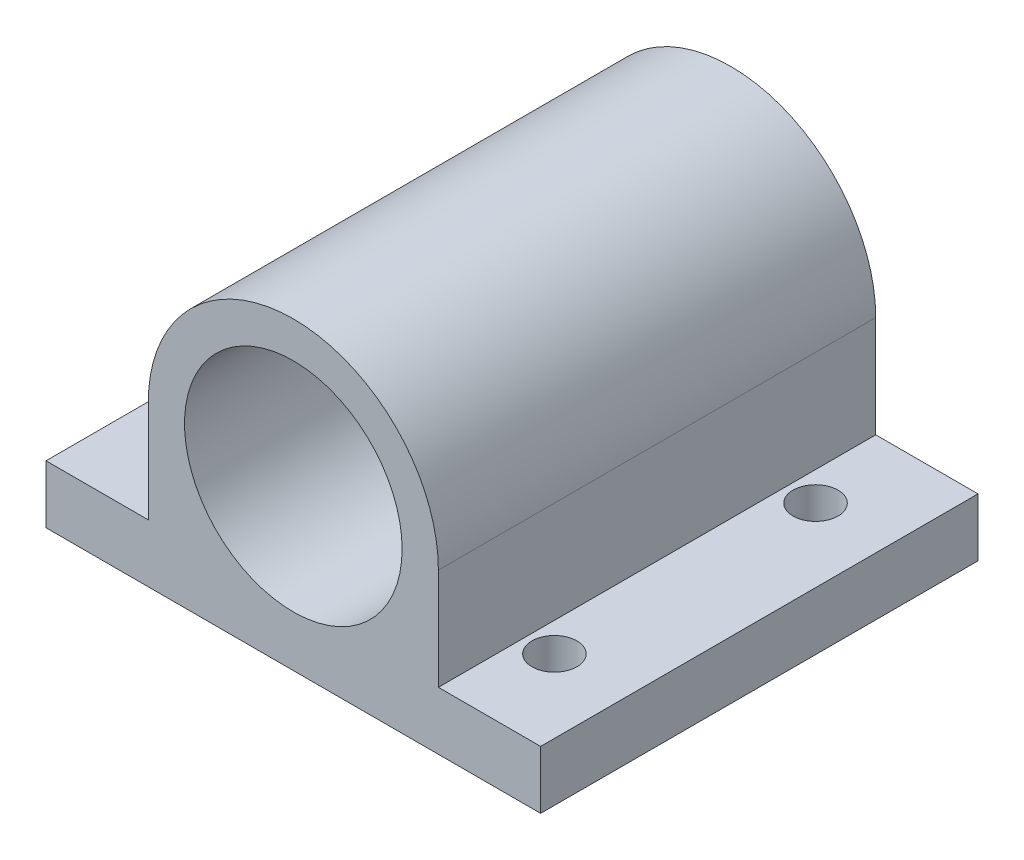
ISO-10303-21;
HEADER;
FILE_DESCRIPTION(('STEP AP214'),'2;1');
FILE_NAME('part.step','',(''),(''),'','','');
FILE_SCHEMA(('AUTOMOTIVE_DESIGN { 1 0 10303 214 1 1 1 1 }'));
ENDSEC;
DATA;
#1=APPLICATION_CONTEXT('core data for automotive mechanical design processes');
#2=APPLICATION_PROTOCOL_DEFINITION('international standard','automotive_design',2000,#1);
#3=PRODUCT_CONTEXT('',#1,'mechanical');
#4=PRODUCT('Part','Part','',(#3));
#5=PRODUCT_RELATED_PRODUCT_CATEGORY('part','',(#4));
#6=PRODUCT_DEFINITION_FORMATION('','',#4);
#7=PRODUCT_DEFINITION_CONTEXT('part definition',#1,'design');
#8=PRODUCT_DEFINITION('design','',#6,#7);
#9=PRODUCT_DEFINITION_SHAPE('','',#8);
#10=(LENGTH_UNIT() NAMED_UNIT(*) SI_UNIT(.MILLI.,.METRE.));
#11=(NAMED_UNIT(*) PLANE_ANGLE_UNIT() SI_UNIT($,.RADIAN.));
#12=(NAMED_UNIT(*) SI_UNIT($,.STERADIAN.) SOLID_ANGLE_UNIT());
#13=UNCERTAINTY_MEASURE_WITH_UNIT(LENGTH_MEASURE(1.E-05),#10,'distance_accuracy_value','');
#14=(GEOMETRIC_REPRESENTATION_CONTEXT(3) GLOBAL_UNCERTAINTY_ASSIGNED_CONTEXT((#13)) GLOBAL_UNIT_ASSIGNED_CONTEXT((#10,
#11,#12)) REPRESENTATION_CONTEXT('',''));
#15=CARTESIAN_POINT('',(0.,0.,0.));
#16=DIRECTION('',(0.,0.,1.));
#17=DIRECTION('',(1.,0.,0.));
#18=AXIS2_PLACEMENT_3D('',#15,#16,#17);
#19=CARTESIAN_POINT('',(0.,0.,-30.15));
#20=DIRECTION('',(1.,0.,0.));
#21=DIRECTION('',(0.,0.,-1.));
#22=AXIS2_PLACEMENT_3D('',#19,#20,#21);
#23=PLANE('',#22);
#24=DIRECTION('',(0.,1.,0.));
#25=VECTOR('',#24,1.);
#26=CARTESIAN_POINT('',(0.,0.,0.));
#27=LINE('',#26,#25);
#28=CARTESIAN_POINT('',(0.,0.,0.));
#29=VERTEX_POINT('',#28);
#30=CARTESIAN_POINT('',(0.,4.,0.));
#31=VERTEX_POINT('',#30);
#32=EDGE_CURVE('E143',#29,#31,#27,.T.);
#33=ORIENTED_EDGE('',*,*,#32,.F.);
#34=DIRECTION('',(0.,0.,1.));
#35=VECTOR('',#34,1.);
#36=CARTESIAN_POINT('',(0.,0.,-30.15));
#37=LINE('',#36,#35);
#38=CARTESIAN_POINT('',(0.,0.,-30.15));
#39=VERTEX_POINT('',#38);
#40=EDGE_CURVE('E11',#39,#29,#37,.T.);
#41=ORIENTED_EDGE('',*,*,#40,.F.);
#42=DIRECTION('',(0.,1.,0.));
#43=VECTOR('',#42,1.);
#44=CARTESIAN_POINT('',(0.,0.,-30.15));
#45=LINE('',#44,#43);
#46=CARTESIAN_POINT('',(0.,4.,-30.15));
#47=VERTEX_POINT('',#46);
#48=EDGE_CURVE('E172',#39,#47,#45,.T.);
#49=ORIENTED_EDGE('',*,*,#48,.T.);
#50=DIRECTION('',(0.,0.,1.));
#51=VECTOR('',#50,1.);
#52=CARTESIAN_POINT('',(0.,4.,-30.15));
#53=LINE('',#52,#51);
#54=EDGE_CURVE('E96',#47,#31,#53,.T.);
#55=ORIENTED_EDGE('',*,*,#54,.T.);
#56=EDGE_LOOP('',(#33,#41,#49,#55));
#57=FACE_BOUND('',#56,.T.);
#58=ADVANCED_FACE('F39',(#57),#23,.T.);
#59=CARTESIAN_POINT('',(0.,0.,-30.15));
#60=DIRECTION('',(0.,-1.,0.));
#61=DIRECTION('',(1.,0.,0.));
#62=AXIS2_PLACEMENT_3D('',#59,#60,#61);
#63=PLANE('',#62);
#64=CARTESIAN_POINT('',(-5.05,0.,-6.));
#65=DIRECTION('',(0.,-1.,0.));
#66=DIRECTION('',(1.,0.,0.));
#67=AXIS2_PLACEMENT_3D('',#64,#65,#66);
#68=CIRCLE('',#67,1.55);
#69=CARTESIAN_POINT('',(-3.5,0.,-6.));
#70=VERTEX_POINT('',#69);
#71=EDGE_CURVE('E284',#70,#70,#68,.T.);
#72=ORIENTED_EDGE('',*,*,#71,.F.);
#73=EDGE_LOOP('',(#72));
#74=FACE_BOUND('',#73,.T.);
#75=CARTESIAN_POINT('',(-5.05,0.,-24.));
#76=DIRECTION('',(0.,-1.,0.));
#77=DIRECTION('',(1.,0.,0.));
#78=AXIS2_PLACEMENT_3D('',#75,#76,#77);
#79=CIRCLE('',#78,1.55);
#80=CARTESIAN_POINT('',(-3.5,0.,-24.));
#81=VERTEX_POINT('',#80);
#82=EDGE_CURVE('E281',#81,#81,#79,.T.);
#83=ORIENTED_EDGE('',*,*,#82,.F.);
#84=EDGE_LOOP('',(#83));
#85=FACE_BOUND('',#84,.T.);
#86=CARTESIAN_POINT('',(-29.05,0.,-24.));
#87=DIRECTION('',(0.,-1.,0.));
#88=DIRECTION('',(1.,0.,0.));
#89=AXIS2_PLACEMENT_3D('',#86,#87,#88);
#90=CIRCLE('',#89,1.55);
#91=CARTESIAN_POINT('',(-27.5,0.,-24.));
#92=VERTEX_POINT('',#91);
#93=EDGE_CURVE('E283',#92,#92,#90,.T.);
#94=ORIENTED_EDGE('',*,*,#93,.F.);
#95=EDGE_LOOP('',(#94));
#96=FACE_BOUND('',#95,.T.);
#97=CARTESIAN_POINT('',(-29.05,0.,-6.));
#98=DIRECTION('',(0.,-1.,0.));
#99=DIRECTION('',(1.,0.,0.));
#100=AXIS2_PLACEMENT_3D('',#97,#98,#99);
#101=CIRCLE('',#100,1.55);
#102=CARTESIAN_POINT('',(-27.5,0.,-6.));
#103=VERTEX_POINT('',#102);
#104=EDGE_CURVE('E194',#103,#103,#101,.T.);
#105=ORIENTED_EDGE('',*,*,#104,.F.);
#106=EDGE_LOOP('',(#105));
#107=FACE_BOUND('',#106,.T.);
#108=DIRECTION('',(1.,0.,0.));
#109=VECTOR('',#108,1.);
#110=CARTESIAN_POINT('',(0.,0.,0.));
#111=LINE('',#110,#109);
#112=CARTESIAN_POINT('',(-34.1,0.,0.));
#113=VERTEX_POINT('',#112);
#114=EDGE_CURVE('E169',#113,#29,#111,.T.);
#115=ORIENTED_EDGE('',*,*,#114,.F.);
#116=DIRECTION('',(0.,0.,1.));
#117=VECTOR('',#116,1.);
#118=CARTESIAN_POINT('',(-34.1,0.,-30.15));
#119=LINE('',#118,#117);
#120=CARTESIAN_POINT('',(-34.1,0.,-30.15));
#121=VERTEX_POINT('',#120);
#122=EDGE_CURVE('E49',#121,#113,#119,.T.);
#123=ORIENTED_EDGE('',*,*,#122,.F.);
#124=DIRECTION('',(1.,0.,0.));
#125=VECTOR('',#124,1.);
#126=CARTESIAN_POINT('',(0.,0.,-30.15));
#127=LINE('',#126,#125);
#128=EDGE_CURVE('E129',#121,#39,#127,.T.);
#129=ORIENTED_EDGE('',*,*,#128,.T.);
#130=ORIENTED_EDGE('',*,*,#40,.T.);
#131=EDGE_LOOP('',(#115,#123,#129,#130));
#132=FACE_BOUND('',#131,.T.);
#133=ADVANCED_FACE('F239',(#74,#85,#96,#107,#132),#63,.T.);
#134=CARTESIAN_POINT('',(-34.1,0.,-30.15));
#135=DIRECTION('',(-1.,0.,0.));
#136=DIRECTION('',(0.,-1.,0.));
#137=AXIS2_PLACEMENT_3D('',#134,#135,#136);
#138=PLANE('',#137);
#139=DIRECTION('',(0.,-1.,0.));
#140=VECTOR('',#139,1.);
#141=CARTESIAN_POINT('',(-34.1,0.,0.));
#142=LINE('',#141,#140);
#143=CARTESIAN_POINT('',(-34.1,4.,0.));
#144=VERTEX_POINT('',#143);
#145=EDGE_CURVE('E115',#144,#113,#142,.T.);
#146=ORIENTED_EDGE('',*,*,#145,.F.);
#147=DIRECTION('',(0.,0.,1.));
#148=VECTOR('',#147,1.);
#149=CARTESIAN_POINT('',(-34.1,4.,-30.15));
#150=LINE('',#149,#148);
#151=CARTESIAN_POINT('',(-34.1,4.,-30.15));
#152=VERTEX_POINT('',#151);
#153=EDGE_CURVE('E110',#152,#144,#150,.T.);
#154=ORIENTED_EDGE('',*,*,#153,.F.);
#155=DIRECTION('',(0.,-1.,0.));
#156=VECTOR('',#155,1.);
#157=CARTESIAN_POINT('',(-34.1,0.,-30.15));
#158=LINE('',#157,#156);
#159=EDGE_CURVE('E113',#152,#121,#158,.T.);
#160=ORIENTED_EDGE('',*,*,#159,.T.);
#161=ORIENTED_EDGE('',*,*,#122,.T.);
#162=EDGE_LOOP('',(#146,#154,#160,#161));
#163=FACE_BOUND('',#162,.T.);
#164=ADVANCED_FACE('F112',(#163),#138,.T.);
#165=CARTESIAN_POINT('',(-27.05,4.,-30.15));
#166=DIRECTION('',(0.,1.,0.));
#167=DIRECTION('',(-1.,0.,0.));
#168=AXIS2_PLACEMENT_3D('',#165,#166,#167);
#169=PLANE('',#168);
#170=CARTESIAN_POINT('',(-29.05,4.,-24.));
#171=DIRECTION('',(0.,1.,0.));
#172=DIRECTION('',(-1.,0.,0.));
#173=AXIS2_PLACEMENT_3D('',#170,#171,#172);
#174=CIRCLE('',#173,1.55);
#175=CARTESIAN_POINT('',(-30.6,4.,-24.));
#176=VERTEX_POINT('',#175);
#177=EDGE_CURVE('E42',#176,#176,#174,.T.);
#178=ORIENTED_EDGE('',*,*,#177,.F.);
#179=EDGE_LOOP('',(#178));
#180=FACE_BOUND('',#179,.T.);
#181=CARTESIAN_POINT('',(-29.05,4.,-6.));
#182=DIRECTION('',(0.,1.,0.));
#183=DIRECTION('',(-1.,0.,0.));
#184=AXIS2_PLACEMENT_3D('',#181,#182,#183);
#185=CIRCLE('',#184,1.55);
#186=CARTESIAN_POINT('',(-30.6,4.,-6.));
#187=VERTEX_POINT('',#186);
#188=EDGE_CURVE('E197',#187,#187,#185,.T.);
#189=ORIENTED_EDGE('',*,*,#188,.F.);
#190=EDGE_LOOP('',(#189));
#191=FACE_BOUND('',#190,.T.);
#192=DIRECTION('',(-1.,0.,0.));
#193=VECTOR('',#192,1.);
#194=CARTESIAN_POINT('',(-27.05,4.,0.));
#195=LINE('',#194,#193);
#196=CARTESIAN_POINT('',(-27.05,4.,0.));
#197=VERTEX_POINT('',#196);
#198=EDGE_CURVE('E164',#197,#144,#195,.T.);
#199=ORIENTED_EDGE('',*,*,#198,.F.);
#200=DIRECTION('',(0.,0.,1.));
#201=VECTOR('',#200,1.);
#202=CARTESIAN_POINT('',(-27.05,4.,-30.15));
#203=LINE('',#202,#201);
#204=CARTESIAN_POINT('',(-27.05,4.,-30.15));
#205=VERTEX_POINT('',#204);
#206=EDGE_CURVE('E121',#205,#197,#203,.T.);
#207=ORIENTED_EDGE('',*,*,#206,.F.);
#208=DIRECTION('',(-1.,0.,0.));
#209=VECTOR('',#208,1.);
#210=CARTESIAN_POINT('',(-27.05,4.,-30.15));
#211=LINE('',#210,#209);
#212=EDGE_CURVE('E127',#205,#152,#211,.T.);
#213=ORIENTED_EDGE('',*,*,#212,.T.);
#214=ORIENTED_EDGE('',*,*,#153,.T.);
#215=EDGE_LOOP('',(#199,#207,#213,#214));
#216=FACE_BOUND('',#215,.T.);
#217=ADVANCED_FACE('F132',(#180,#191,#216),#169,.T.);
#218=CARTESIAN_POINT('',(-27.05,11.,-30.15));
#219=DIRECTION('',(-1.,0.,0.));
#220=DIRECTION('',(0.,-1.,0.));
#221=AXIS2_PLACEMENT_3D('',#218,#219,#220);
#222=PLANE('',#221);
#223=DIRECTION('',(0.,-1.,0.));
#224=VECTOR('',#223,1.);
#225=CARTESIAN_POINT('',(-27.05,11.,0.));
#226=LINE('',#225,#224);
#227=CARTESIAN_POINT('',(-27.05,11.,0.));
#228=VERTEX_POINT('',#227);
#229=EDGE_CURVE('E160',#228,#197,#226,.T.);
#230=ORIENTED_EDGE('',*,*,#229,.F.);
#231=DIRECTION('',(0.,0.,1.));
#232=VECTOR('',#231,1.);
#233=CARTESIAN_POINT('',(-27.05,11.,-30.15));
#234=LINE('',#233,#232);
#235=CARTESIAN_POINT('',(-27.05,11.,-30.15));
#236=VERTEX_POINT('',#235);
#237=EDGE_CURVE('E178',#236,#228,#234,.T.);
#238=ORIENTED_EDGE('',*,*,#237,.F.);
#239=DIRECTION('',(0.,-1.,0.));
#240=VECTOR('',#239,1.);
#241=CARTESIAN_POINT('',(-27.05,11.,-30.15));
#242=LINE('',#241,#240);
#243=EDGE_CURVE('E134',#236,#205,#242,.T.);
#244=ORIENTED_EDGE('',*,*,#243,.T.);
#245=ORIENTED_EDGE('',*,*,#206,.T.);
#246=EDGE_LOOP('',(#230,#238,#244,#245));
#247=FACE_BOUND('',#246,.T.);
#248=ADVANCED_FACE('F255',(#247),#222,.T.);
#249=CARTESIAN_POINT('',(-17.05,11.,-30.15));
#250=DIRECTION('',(0.,0.,1.));
#251=DIRECTION('',(1.,0.,0.));
#252=AXIS2_PLACEMENT_3D('',#249,#250,#251);
#253=CYLINDRICAL_SURFACE('',#252,9.99999999999999);
#254=CARTESIAN_POINT('',(-17.05,11.,0.));
#255=DIRECTION('',(0.,0.,1.));
#256=DIRECTION('',(1.,0.,0.));
#257=AXIS2_PLACEMENT_3D('',#254,#255,#256);
#258=CIRCLE('',#257,9.99999999999999);
#259=CARTESIAN_POINT('',(-7.05000000000001,11.,0.));
#260=VERTEX_POINT('',#259);
#261=EDGE_CURVE('E156',#260,#228,#258,.T.);
#262=ORIENTED_EDGE('',*,*,#261,.F.);
#263=DIRECTION('',(0.,0.,1.));
#264=VECTOR('',#263,1.);
#265=CARTESIAN_POINT('',(-7.05000000000001,11.,-30.15));
#266=LINE('',#265,#264);
#267=CARTESIAN_POINT('',(-7.05000000000001,11.,-30.15));
#268=VERTEX_POINT('',#267);
#269=EDGE_CURVE('E181',#268,#260,#266,.T.);
#270=ORIENTED_EDGE('',*,*,#269,.F.);
#271=CARTESIAN_POINT('',(-17.05,11.,-30.15));
#272=DIRECTION('',(0.,0.,1.));
#273=DIRECTION('',(1.,0.,0.));
#274=AXIS2_PLACEMENT_3D('',#271,#272,#273);
#275=CIRCLE('',#274,9.99999999999999);
#276=EDGE_CURVE('E137',#268,#236,#275,.T.);
#277=ORIENTED_EDGE('',*,*,#276,.T.);
#278=ORIENTED_EDGE('',*,*,#237,.T.);
#279=EDGE_LOOP('',(#262,#270,#277,#278));
#280=FACE_BOUND('',#279,.T.);
#281=ADVANCED_FACE('F230',(#280),#253,.T.);
#282=CARTESIAN_POINT('',(-7.05000000000001,11.,-30.15));
#283=DIRECTION('',(1.,0.,0.));
#284=DIRECTION('',(0.,1.,0.));
#285=AXIS2_PLACEMENT_3D('',#282,#283,#284);
#286=PLANE('',#285);
#287=DIRECTION('',(0.,1.,0.));
#288=VECTOR('',#287,1.);
#289=CARTESIAN_POINT('',(-7.05000000000001,11.,0.));
#290=LINE('',#289,#288);
#291=CARTESIAN_POINT('',(-7.05,4.,0.));
#292=VERTEX_POINT('',#291);
#293=EDGE_CURVE('E152',#292,#260,#290,.T.);
#294=ORIENTED_EDGE('',*,*,#293,.F.);
#295=DIRECTION('',(0.,0.,1.));
#296=VECTOR('',#295,1.);
#297=CARTESIAN_POINT('',(-7.05,4.,-30.15));
#298=LINE('',#297,#296);
#299=CARTESIAN_POINT('',(-7.05,4.,-30.15));
#300=VERTEX_POINT('',#299);
#301=EDGE_CURVE('E184',#300,#292,#298,.T.);
#302=ORIENTED_EDGE('',*,*,#301,.F.);
#303=DIRECTION('',(0.,1.,0.));
#304=VECTOR('',#303,1.);
#305=CARTESIAN_POINT('',(-7.05000000000001,11.,-30.15));
#306=LINE('',#305,#304);
#307=EDGE_CURVE('E222',#300,#268,#306,.T.);
#308=ORIENTED_EDGE('',*,*,#307,.T.);
#309=ORIENTED_EDGE('',*,*,#269,.T.);
#310=EDGE_LOOP('',(#294,#302,#308,#309));
#311=FACE_BOUND('',#310,.T.);
#312=ADVANCED_FACE('F235',(#311),#286,.T.);
#313=CARTESIAN_POINT('',(-7.05,4.,-30.15));
#314=DIRECTION('',(0.,1.,0.));
#315=DIRECTION('',(0.,0.,1.));
#316=AXIS2_PLACEMENT_3D('',#313,#314,#315);
#317=PLANE('',#316);
#318=CARTESIAN_POINT('',(-5.05,4.,-6.));
#319=DIRECTION('',(0.,1.,0.));
#320=DIRECTION('',(0.,0.,1.));
#321=AXIS2_PLACEMENT_3D('',#318,#319,#320);
#322=CIRCLE('',#321,1.55);
#323=CARTESIAN_POINT('',(-5.05,4.,-4.45));
#324=VERTEX_POINT('',#323);
#325=EDGE_CURVE('E193',#324,#324,#322,.T.);
#326=ORIENTED_EDGE('',*,*,#325,.F.);
#327=EDGE_LOOP('',(#326));
#328=FACE_BOUND('',#327,.T.);
#329=CARTESIAN_POINT('',(-5.05,4.,-24.));
#330=DIRECTION('',(0.,1.,0.));
#331=DIRECTION('',(0.,0.,1.));
#332=AXIS2_PLACEMENT_3D('',#329,#330,#331);
#333=CIRCLE('',#332,1.55);
#334=CARTESIAN_POINT('',(-5.05,4.,-22.45));
#335=VERTEX_POINT('',#334);
#336=EDGE_CURVE('E189',#335,#335,#333,.T.);
#337=ORIENTED_EDGE('',*,*,#336,.F.);
#338=EDGE_LOOP('',(#337));
#339=FACE_BOUND('',#338,.T.);
#340=DIRECTION('',(-1.,0.,0.));
#341=VECTOR('',#340,1.);
#342=CARTESIAN_POINT('',(-7.05,4.,0.));
#343=LINE('',#342,#341);
#344=EDGE_CURVE('E147',#31,#292,#343,.T.);
#345=ORIENTED_EDGE('',*,*,#344,.F.);
#346=ORIENTED_EDGE('',*,*,#54,.F.);
#347=DIRECTION('',(-1.,0.,0.));
#348=VECTOR('',#347,1.);
#349=CARTESIAN_POINT('',(-7.05,4.,-30.15));
#350=LINE('',#349,#348);
#351=EDGE_CURVE('E219',#47,#300,#350,.T.);
#352=ORIENTED_EDGE('',*,*,#351,.T.);
#353=ORIENTED_EDGE('',*,*,#301,.T.);
#354=EDGE_LOOP('',(#345,#346,#352,#353));
#355=FACE_BOUND('',#354,.T.);
#356=ADVANCED_FACE('F236',(#328,#339,#355),#317,.T.);
#357=CARTESIAN_POINT('',(-17.05,11.,-30.15));
#358=DIRECTION('',(0.,0.,1.));
#359=DIRECTION('',(1.,0.,0.));
#360=AXIS2_PLACEMENT_3D('',#357,#358,#359);
#361=PLANE('',#360);
#362=CARTESIAN_POINT('',(-17.05,11.,-30.15));
#363=DIRECTION('',(0.,0.,1.));
#364=DIRECTION('',(1.,0.,0.));
#365=AXIS2_PLACEMENT_3D('',#362,#363,#364);
#366=CIRCLE('',#365,7.5);
#367=CARTESIAN_POINT('',(-9.55,11.,-30.15));
#368=VERTEX_POINT('',#367);
#369=EDGE_CURVE('E148',#368,#368,#366,.T.);
#370=ORIENTED_EDGE('',*,*,#369,.T.);
#371=EDGE_LOOP('',(#370));
#372=FACE_BOUND('',#371,.T.);
#373=ORIENTED_EDGE('',*,*,#48,.F.);
#374=ORIENTED_EDGE('',*,*,#128,.F.);
#375=ORIENTED_EDGE('',*,*,#159,.F.);
#376=ORIENTED_EDGE('',*,*,#212,.F.);
#377=ORIENTED_EDGE('',*,*,#243,.F.);
#378=ORIENTED_EDGE('',*,*,#276,.F.);
#379=ORIENTED_EDGE('',*,*,#307,.F.);
#380=ORIENTED_EDGE('',*,*,#351,.F.);
#381=EDGE_LOOP('',(#373,#374,#375,#376,#377,#378,#379,#380));
#382=FACE_BOUND('',#381,.T.);
#383=ADVANCED_FACE('F125',(#372,#382),#361,.F.);
#384=CARTESIAN_POINT('',(-17.05,11.,0.));
#385=DIRECTION('',(0.,0.,1.));
#386=DIRECTION('',(1.,0.,0.));
#387=AXIS2_PLACEMENT_3D('',#384,#385,#386);
#388=PLANE('',#387);
#389=CARTESIAN_POINT('',(-17.05,11.,0.));
#390=DIRECTION('',(0.,0.,1.));
#391=DIRECTION('',(1.,0.,0.));
#392=AXIS2_PLACEMENT_3D('',#389,#390,#391);
#393=CIRCLE('',#392,7.5);
#394=CARTESIAN_POINT('',(-9.55,11.,0.));
#395=VERTEX_POINT('',#394);
#396=EDGE_CURVE('E204',#395,#395,#393,.T.);
#397=ORIENTED_EDGE('',*,*,#396,.F.);
#398=EDGE_LOOP('',(#397));
#399=FACE_BOUND('',#398,.T.);
#400=ORIENTED_EDGE('',*,*,#32,.T.);
#401=ORIENTED_EDGE('',*,*,#344,.T.);
#402=ORIENTED_EDGE('',*,*,#293,.T.);
#403=ORIENTED_EDGE('',*,*,#261,.T.);
#404=ORIENTED_EDGE('',*,*,#229,.T.);
#405=ORIENTED_EDGE('',*,*,#198,.T.);
#406=ORIENTED_EDGE('',*,*,#145,.T.);
#407=ORIENTED_EDGE('',*,*,#114,.T.);
#408=EDGE_LOOP('',(#400,#401,#402,#403,#404,#405,#406,#407));
#409=FACE_BOUND('',#408,.T.);
#410=ADVANCED_FACE('F238',(#399,#409),#388,.T.);
#411=CARTESIAN_POINT('',(-17.05,11.,-30.15));
#412=DIRECTION('',(0.,0.,1.));
#413=DIRECTION('',(1.,0.,0.));
#414=AXIS2_PLACEMENT_3D('',#411,#412,#413);
#415=CYLINDRICAL_SURFACE('',#414,7.5);
#416=ORIENTED_EDGE('',*,*,#369,.F.);
#417=EDGE_LOOP('',(#416));
#418=FACE_BOUND('',#417,.T.);
#419=ORIENTED_EDGE('',*,*,#396,.T.);
#420=EDGE_LOOP('',(#419));
#421=FACE_BOUND('',#420,.T.);
#422=ADVANCED_FACE('F277',(#418,#421),#415,.F.);
#423=CARTESIAN_POINT('',(-5.05,30.15,-24.));
#424=DIRECTION('',(0.,-1.,0.));
#425=DIRECTION('',(1.,0.,0.));
#426=AXIS2_PLACEMENT_3D('',#423,#424,#425);
#427=CYLINDRICAL_SURFACE('',#426,1.55);
#428=ORIENTED_EDGE('',*,*,#336,.T.);
#429=EDGE_LOOP('',(#428));
#430=FACE_BOUND('',#429,.T.);
#431=ORIENTED_EDGE('',*,*,#82,.T.);
#432=EDGE_LOOP('',(#431));
#433=FACE_BOUND('',#432,.T.);
#434=ADVANCED_FACE('F273',(#430,#433),#427,.F.);
#435=CARTESIAN_POINT('',(-5.05,30.15,-6.));
#436=DIRECTION('',(0.,-1.,0.));
#437=DIRECTION('',(1.,0.,0.));
#438=AXIS2_PLACEMENT_3D('',#435,#436,#437);
#439=CYLINDRICAL_SURFACE('',#438,1.55);
#440=ORIENTED_EDGE('',*,*,#325,.T.);
#441=EDGE_LOOP('',(#440));
#442=FACE_BOUND('',#441,.T.);
#443=ORIENTED_EDGE('',*,*,#71,.T.);
#444=EDGE_LOOP('',(#443));
#445=FACE_BOUND('',#444,.T.);
#446=ADVANCED_FACE('F276',(#442,#445),#439,.F.);
#447=CARTESIAN_POINT('',(-29.05,30.15,-6.));
#448=DIRECTION('',(0.,-1.,0.));
#449=DIRECTION('',(1.,0.,0.));
#450=AXIS2_PLACEMENT_3D('',#447,#448,#449);
#451=CYLINDRICAL_SURFACE('',#450,1.55);
#452=ORIENTED_EDGE('',*,*,#188,.T.);
#453=EDGE_LOOP('',(#452));
#454=FACE_BOUND('',#453,.T.);
#455=ORIENTED_EDGE('',*,*,#104,.T.);
#456=EDGE_LOOP('',(#455));
#457=FACE_BOUND('',#456,.T.);
#458=ADVANCED_FACE('F296',(#454,#457),#451,.F.);
#459=CARTESIAN_POINT('',(-29.05,30.15,-24.));
#460=DIRECTION('',(0.,-1.,0.));
#461=DIRECTION('',(1.,0.,0.));
#462=AXIS2_PLACEMENT_3D('',#459,#460,#461);
#463=CYLINDRICAL_SURFACE('',#462,1.55);
#464=ORIENTED_EDGE('',*,*,#177,.T.);
#465=EDGE_LOOP('',(#464));
#466=FACE_BOUND('',#465,.T.);
#467=ORIENTED_EDGE('',*,*,#93,.T.);
#468=EDGE_LOOP('',(#467));
#469=FACE_BOUND('',#468,.T.);
#470=ADVANCED_FACE('F299',(#466,#469),#463,.F.);
#471=CLOSED_SHELL('',(#58,#133,#164,#217,#248,#281,#312,#356,#383,#410,#422,#434,#446,#458,#470));
#472=MANIFOLD_SOLID_BREP('B2',#471);
#473=ADVANCED_BREP_SHAPE_REPRESENTATION('',(#18,#472),#14);
#474=SHAPE_DEFINITION_REPRESENTATION(#9,#473);
ENDSEC;
END-ISO-10303-21;
